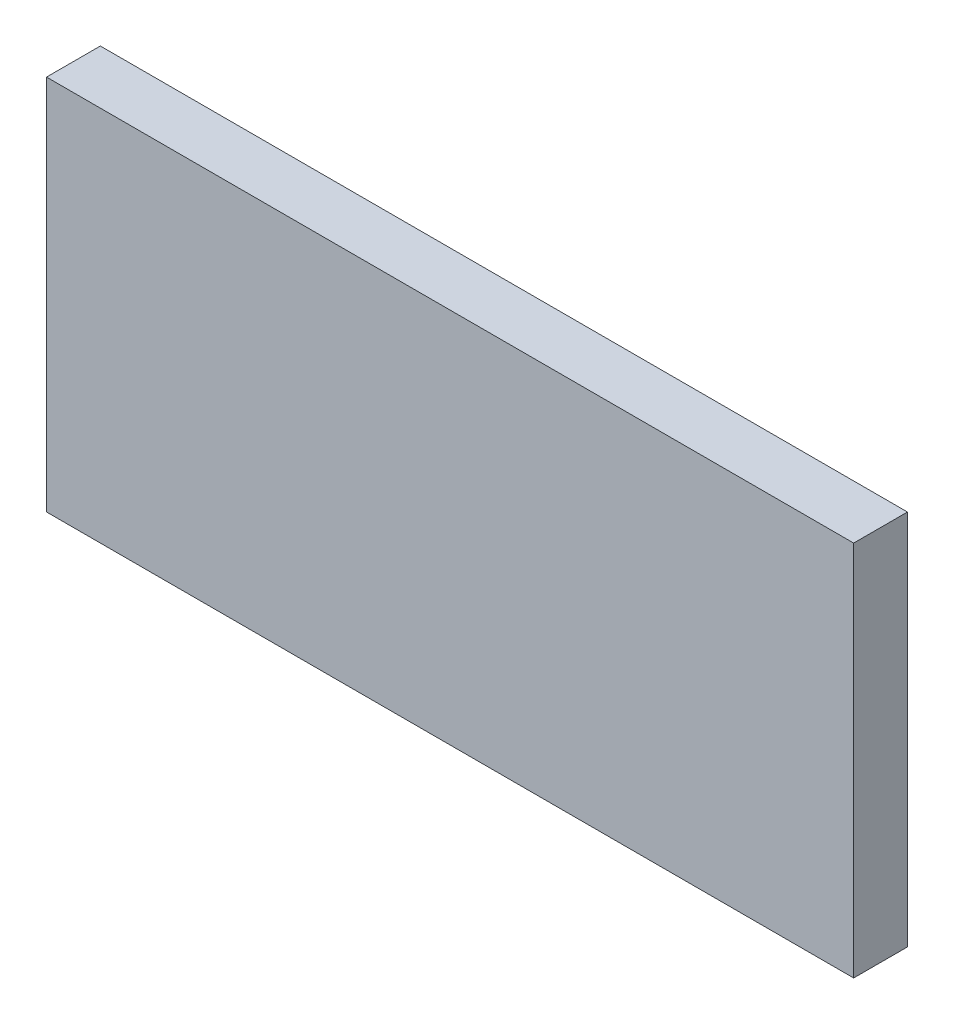
ISO-10303-21;
HEADER;
FILE_DESCRIPTION(('STEP AP214'),'2;1');
FILE_NAME('part.step','',(''),(''),'','','');
FILE_SCHEMA(('AUTOMOTIVE_DESIGN { 1 0 10303 214 1 1 1 1 }'));
ENDSEC;
DATA;
#1=APPLICATION_CONTEXT('core data for automotive mechanical design processes');
#2=APPLICATION_PROTOCOL_DEFINITION('international standard','automotive_design',2000,#1);
#3=PRODUCT_CONTEXT('',#1,'mechanical');
#4=PRODUCT('Part','Part','',(#3));
#5=PRODUCT_RELATED_PRODUCT_CATEGORY('part','',(#4));
#6=PRODUCT_DEFINITION_FORMATION('','',#4);
#7=PRODUCT_DEFINITION_CONTEXT('part definition',#1,'design');
#8=PRODUCT_DEFINITION('design','',#6,#7);
#9=PRODUCT_DEFINITION_SHAPE('','',#8);
#10=(LENGTH_UNIT() NAMED_UNIT(*) SI_UNIT(.MILLI.,.METRE.));
#11=(NAMED_UNIT(*) PLANE_ANGLE_UNIT() SI_UNIT($,.RADIAN.));
#12=(NAMED_UNIT(*) SI_UNIT($,.STERADIAN.) SOLID_ANGLE_UNIT());
#13=UNCERTAINTY_MEASURE_WITH_UNIT(LENGTH_MEASURE(1.E-05),#10,'distance_accuracy_value','');
#14=(GEOMETRIC_REPRESENTATION_CONTEXT(3) GLOBAL_UNCERTAINTY_ASSIGNED_CONTEXT((#13)) GLOBAL_UNIT_ASSIGNED_CONTEXT((#10,
#11,#12)) REPRESENTATION_CONTEXT('',''));
#15=CARTESIAN_POINT('',(0.,0.,0.));
#16=DIRECTION('',(0.,0.,1.));
#17=DIRECTION('',(1.,0.,0.));
#18=AXIS2_PLACEMENT_3D('',#15,#16,#17);
#19=CARTESIAN_POINT('',(0.,0.,10.));
#20=DIRECTION('',(1.,0.,0.));
#21=DIRECTION('',(0.,0.,-1.));
#22=AXIS2_PLACEMENT_3D('',#19,#20,#21);
#23=PLANE('',#22);
#24=DIRECTION('',(0.,-1.,0.));
#25=VECTOR('',#24,1.);
#26=CARTESIAN_POINT('',(0.,0.,0.));
#27=LINE('',#26,#25);
#28=CARTESIAN_POINT('',(0.,70.,0.));
#29=VERTEX_POINT('',#28);
#30=CARTESIAN_POINT('',(0.,0.,0.));
#31=VERTEX_POINT('',#30);
#32=EDGE_CURVE('E96',#29,#31,#27,.T.);
#33=ORIENTED_EDGE('',*,*,#32,.T.);
#34=DIRECTION('',(0.,0.,-1.));
#35=VECTOR('',#34,1.);
#36=CARTESIAN_POINT('',(0.,0.,10.));
#37=LINE('',#36,#35);
#38=CARTESIAN_POINT('',(0.,0.,10.));
#39=VERTEX_POINT('',#38);
#40=EDGE_CURVE('E11',#39,#31,#37,.T.);
#41=ORIENTED_EDGE('',*,*,#40,.F.);
#42=DIRECTION('',(0.,-1.,0.));
#43=VECTOR('',#42,1.);
#44=CARTESIAN_POINT('',(0.,0.,10.));
#45=LINE('',#44,#43);
#46=CARTESIAN_POINT('',(0.,70.,10.));
#47=VERTEX_POINT('',#46);
#48=EDGE_CURVE('E84',#47,#39,#45,.T.);
#49=ORIENTED_EDGE('',*,*,#48,.F.);
#50=DIRECTION('',(0.,0.,-1.));
#51=VECTOR('',#50,1.);
#52=CARTESIAN_POINT('',(0.,70.,10.));
#53=LINE('',#52,#51);
#54=EDGE_CURVE('E92',#47,#29,#53,.T.);
#55=ORIENTED_EDGE('',*,*,#54,.T.);
#56=EDGE_LOOP('',(#33,#41,#49,#55));
#57=FACE_BOUND('',#56,.T.);
#58=ADVANCED_FACE('F33',(#57),#23,.F.);
#59=CARTESIAN_POINT('',(0.,0.,10.));
#60=DIRECTION('',(0.,1.,0.));
#61=DIRECTION('',(0.,0.,1.));
#62=AXIS2_PLACEMENT_3D('',#59,#60,#61);
#63=PLANE('',#62);
#64=DIRECTION('',(1.,0.,0.));
#65=VECTOR('',#64,1.);
#66=CARTESIAN_POINT('',(0.,0.,0.));
#67=LINE('',#66,#65);
#68=CARTESIAN_POINT('',(150.,0.,0.));
#69=VERTEX_POINT('',#68);
#70=EDGE_CURVE('E88',#31,#69,#67,.T.);
#71=ORIENTED_EDGE('',*,*,#70,.T.);
#72=DIRECTION('',(0.,0.,-1.));
#73=VECTOR('',#72,1.);
#74=CARTESIAN_POINT('',(150.,0.,10.));
#75=LINE('',#74,#73);
#76=CARTESIAN_POINT('',(150.,0.,10.));
#77=VERTEX_POINT('',#76);
#78=EDGE_CURVE('E41',#77,#69,#75,.T.);
#79=ORIENTED_EDGE('',*,*,#78,.F.);
#80=DIRECTION('',(1.,0.,0.));
#81=VECTOR('',#80,1.);
#82=CARTESIAN_POINT('',(0.,0.,10.));
#83=LINE('',#82,#81);
#84=EDGE_CURVE('E79',#39,#77,#83,.T.);
#85=ORIENTED_EDGE('',*,*,#84,.F.);
#86=ORIENTED_EDGE('',*,*,#40,.T.);
#87=EDGE_LOOP('',(#71,#79,#85,#86));
#88=FACE_BOUND('',#87,.T.);
#89=ADVANCED_FACE('F87',(#88),#63,.F.);
#90=CARTESIAN_POINT('',(150.,0.,10.));
#91=DIRECTION('',(-1.,0.,0.));
#92=DIRECTION('',(0.,0.,1.));
#93=AXIS2_PLACEMENT_3D('',#90,#91,#92);
#94=PLANE('',#93);
#95=DIRECTION('',(0.,1.,0.));
#96=VECTOR('',#95,1.);
#97=CARTESIAN_POINT('',(150.,0.,0.));
#98=LINE('',#97,#96);
#99=CARTESIAN_POINT('',(150.,70.,0.));
#100=VERTEX_POINT('',#99);
#101=EDGE_CURVE('E66',#69,#100,#98,.T.);
#102=ORIENTED_EDGE('',*,*,#101,.T.);
#103=DIRECTION('',(0.,0.,-1.));
#104=VECTOR('',#103,1.);
#105=CARTESIAN_POINT('',(150.,70.,10.));
#106=LINE('',#105,#104);
#107=CARTESIAN_POINT('',(150.,70.,10.));
#108=VERTEX_POINT('',#107);
#109=EDGE_CURVE('E89',#108,#100,#106,.T.);
#110=ORIENTED_EDGE('',*,*,#109,.F.);
#111=DIRECTION('',(0.,1.,0.));
#112=VECTOR('',#111,1.);
#113=CARTESIAN_POINT('',(150.,0.,10.));
#114=LINE('',#113,#112);
#115=EDGE_CURVE('E82',#77,#108,#114,.T.);
#116=ORIENTED_EDGE('',*,*,#115,.F.);
#117=ORIENTED_EDGE('',*,*,#78,.T.);
#118=EDGE_LOOP('',(#102,#110,#116,#117));
#119=FACE_BOUND('',#118,.T.);
#120=ADVANCED_FACE('F90',(#119),#94,.F.);
#121=CARTESIAN_POINT('',(0.,70.,10.));
#122=DIRECTION('',(0.,-1.,0.));
#123=DIRECTION('',(0.,0.,-1.));
#124=AXIS2_PLACEMENT_3D('',#121,#122,#123);
#125=PLANE('',#124);
#126=DIRECTION('',(-1.,0.,0.));
#127=VECTOR('',#126,1.);
#128=CARTESIAN_POINT('',(0.,70.,0.));
#129=LINE('',#128,#127);
#130=EDGE_CURVE('E72',#100,#29,#129,.T.);
#131=ORIENTED_EDGE('',*,*,#130,.T.);
#132=ORIENTED_EDGE('',*,*,#54,.F.);
#133=DIRECTION('',(-1.,0.,0.));
#134=VECTOR('',#133,1.);
#135=CARTESIAN_POINT('',(0.,70.,10.));
#136=LINE('',#135,#134);
#137=EDGE_CURVE('E49',#108,#47,#136,.T.);
#138=ORIENTED_EDGE('',*,*,#137,.F.);
#139=ORIENTED_EDGE('',*,*,#109,.T.);
#140=EDGE_LOOP('',(#131,#132,#138,#139));
#141=FACE_BOUND('',#140,.T.);
#142=ADVANCED_FACE('F103',(#141),#125,.F.);
#143=CARTESIAN_POINT('',(0.,0.,10.));
#144=DIRECTION('',(0.,0.,-1.));
#145=DIRECTION('',(-1.,0.,0.));
#146=AXIS2_PLACEMENT_3D('',#143,#144,#145);
#147=PLANE('',#146);
#148=ORIENTED_EDGE('',*,*,#48,.T.);
#149=ORIENTED_EDGE('',*,*,#84,.T.);
#150=ORIENTED_EDGE('',*,*,#115,.T.);
#151=ORIENTED_EDGE('',*,*,#137,.T.);
#152=EDGE_LOOP('',(#148,#149,#150,#151));
#153=FACE_BOUND('',#152,.T.);
#154=ADVANCED_FACE('F80',(#153),#147,.F.);
#155=CARTESIAN_POINT('',(0.,0.,0.));
#156=DIRECTION('',(0.,0.,-1.));
#157=DIRECTION('',(-1.,0.,0.));
#158=AXIS2_PLACEMENT_3D('',#155,#156,#157);
#159=PLANE('',#158);
#160=ORIENTED_EDGE('',*,*,#32,.F.);
#161=ORIENTED_EDGE('',*,*,#130,.F.);
#162=ORIENTED_EDGE('',*,*,#101,.F.);
#163=ORIENTED_EDGE('',*,*,#70,.F.);
#164=EDGE_LOOP('',(#160,#161,#162,#163));
#165=FACE_BOUND('',#164,.T.);
#166=ADVANCED_FACE('F106',(#165),#159,.T.);
#167=CLOSED_SHELL('',(#58,#89,#120,#142,#154,#166));
#168=MANIFOLD_SOLID_BREP('B2',#167);
#169=ADVANCED_BREP_SHAPE_REPRESENTATION('',(#18,#168),#14);
#170=SHAPE_DEFINITION_REPRESENTATION(#9,#169);
ENDSEC;
END-ISO-10303-21;
